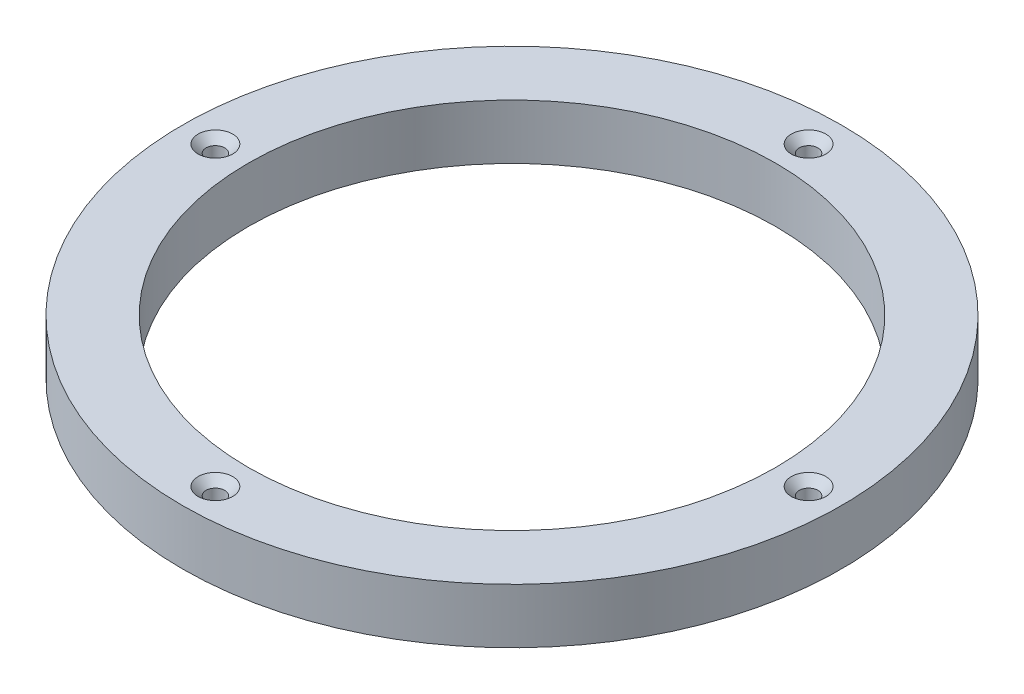
ISO-10303-21;
HEADER;
FILE_DESCRIPTION(('STEP AP214'),'2;1');
FILE_NAME('part.step','',(''),(''),'','','');
FILE_SCHEMA(('AUTOMOTIVE_DESIGN { 1 0 10303 214 1 1 1 1 }'));
ENDSEC;
DATA;
#1=APPLICATION_CONTEXT('core data for automotive mechanical design processes');
#2=APPLICATION_PROTOCOL_DEFINITION('international standard','automotive_design',2000,#1);
#3=PRODUCT_CONTEXT('',#1,'mechanical');
#4=PRODUCT('Part','Part','',(#3));
#5=PRODUCT_RELATED_PRODUCT_CATEGORY('part','',(#4));
#6=PRODUCT_DEFINITION_FORMATION('','',#4);
#7=PRODUCT_DEFINITION_CONTEXT('part definition',#1,'design');
#8=PRODUCT_DEFINITION('design','',#6,#7);
#9=PRODUCT_DEFINITION_SHAPE('','',#8);
#10=(LENGTH_UNIT() NAMED_UNIT(*) SI_UNIT(.MILLI.,.METRE.));
#11=(NAMED_UNIT(*) PLANE_ANGLE_UNIT() SI_UNIT($,.RADIAN.));
#12=(NAMED_UNIT(*) SI_UNIT($,.STERADIAN.) SOLID_ANGLE_UNIT());
#13=UNCERTAINTY_MEASURE_WITH_UNIT(LENGTH_MEASURE(1.E-05),#10,'distance_accuracy_value','');
#14=(GEOMETRIC_REPRESENTATION_CONTEXT(3) GLOBAL_UNCERTAINTY_ASSIGNED_CONTEXT((#13)) GLOBAL_UNIT_ASSIGNED_CONTEXT((#10,
#11,#12)) REPRESENTATION_CONTEXT('',''));
#15=CARTESIAN_POINT('',(0.,0.,0.));
#16=DIRECTION('',(0.,0.,1.));
#17=DIRECTION('',(1.,0.,0.));
#18=AXIS2_PLACEMENT_3D('',#15,#16,#17);
#19=CARTESIAN_POINT('',(0.,10.,0.));
#20=DIRECTION('',(0.,1.,0.));
#21=DIRECTION('',(0.,0.,1.));
#22=AXIS2_PLACEMENT_3D('',#19,#20,#21);
#23=PLANE('',#22);
#24=CARTESIAN_POINT('',(0.,10.,54.));
#25=DIRECTION('',(0.,1.,0.));
#26=DIRECTION('',(0.,0.,1.));
#27=AXIS2_PLACEMENT_3D('',#24,#25,#26);
#28=CIRCLE('',#27,3.15);
#29=CARTESIAN_POINT('',(0.,10.,57.15));
#30=VERTEX_POINT('',#29);
#31=EDGE_CURVE('E131',#30,#30,#28,.T.);
#32=ORIENTED_EDGE('',*,*,#31,.F.);
#33=EDGE_LOOP('',(#32));
#34=FACE_BOUND('',#33,.T.);
#35=CARTESIAN_POINT('',(54.,10.,0.));
#36=DIRECTION('',(0.,1.,0.));
#37=DIRECTION('',(0.,0.,1.));
#38=AXIS2_PLACEMENT_3D('',#35,#36,#37);
#39=CIRCLE('',#38,3.15);
#40=CARTESIAN_POINT('',(54.,10.,3.15));
#41=VERTEX_POINT('',#40);
#42=EDGE_CURVE('E82',#41,#41,#39,.T.);
#43=ORIENTED_EDGE('',*,*,#42,.F.);
#44=EDGE_LOOP('',(#43));
#45=FACE_BOUND('',#44,.T.);
#46=CARTESIAN_POINT('',(0.,10.,-54.));
#47=DIRECTION('',(0.,1.,0.));
#48=DIRECTION('',(0.,0.,1.));
#49=AXIS2_PLACEMENT_3D('',#46,#47,#48);
#50=CIRCLE('',#49,3.15);
#51=CARTESIAN_POINT('',(0.,10.,-50.85));
#52=VERTEX_POINT('',#51);
#53=EDGE_CURVE('E73',#52,#52,#50,.T.);
#54=ORIENTED_EDGE('',*,*,#53,.F.);
#55=EDGE_LOOP('',(#54));
#56=FACE_BOUND('',#55,.T.);
#57=CARTESIAN_POINT('',(-54.,10.,0.));
#58=DIRECTION('',(0.,1.,0.));
#59=DIRECTION('',(0.,0.,1.));
#60=AXIS2_PLACEMENT_3D('',#57,#58,#59);
#61=CIRCLE('',#60,3.15);
#62=CARTESIAN_POINT('',(-54.,10.,3.15));
#63=VERTEX_POINT('',#62);
#64=EDGE_CURVE('E68',#63,#63,#61,.T.);
#65=ORIENTED_EDGE('',*,*,#64,.F.);
#66=EDGE_LOOP('',(#65));
#67=FACE_BOUND('',#66,.T.);
#68=CARTESIAN_POINT('',(0.,10.,0.));
#69=DIRECTION('',(0.,1.,0.));
#70=DIRECTION('',(0.,0.,1.));
#71=AXIS2_PLACEMENT_3D('',#68,#69,#70);
#72=CIRCLE('',#71,60.);
#73=CARTESIAN_POINT('',(0.,10.,60.));
#74=VERTEX_POINT('',#73);
#75=EDGE_CURVE('E10',#74,#74,#72,.T.);
#76=ORIENTED_EDGE('',*,*,#75,.T.);
#77=EDGE_LOOP('',(#76));
#78=FACE_BOUND('',#77,.T.);
#79=CARTESIAN_POINT('',(0.,10.,0.));
#80=DIRECTION('',(0.,1.,0.));
#81=DIRECTION('',(0.,0.,1.));
#82=AXIS2_PLACEMENT_3D('',#79,#80,#81);
#83=CIRCLE('',#82,48.);
#84=CARTESIAN_POINT('',(0.,10.,48.));
#85=VERTEX_POINT('',#84);
#86=EDGE_CURVE('E54',#85,#85,#83,.T.);
#87=ORIENTED_EDGE('',*,*,#86,.F.);
#88=EDGE_LOOP('',(#87));
#89=FACE_BOUND('',#88,.T.);
#90=ADVANCED_FACE('F39',(#34,#45,#56,#67,#78,#89),#23,.T.);
#91=CARTESIAN_POINT('',(0.,0.,0.));
#92=DIRECTION('',(0.,1.,0.));
#93=DIRECTION('',(0.,0.,1.));
#94=AXIS2_PLACEMENT_3D('',#91,#92,#93);
#95=PLANE('',#94);
#96=CARTESIAN_POINT('',(0.,0.,54.));
#97=DIRECTION('',(0.,1.,0.));
#98=DIRECTION('',(0.,0.,1.));
#99=AXIS2_PLACEMENT_3D('',#96,#97,#98);
#100=CIRCLE('',#99,1.69999999999998);
#101=CARTESIAN_POINT('',(0.,0.,55.7));
#102=VERTEX_POINT('',#101);
#103=EDGE_CURVE('E43',#102,#102,#100,.T.);
#104=ORIENTED_EDGE('',*,*,#103,.T.);
#105=EDGE_LOOP('',(#104));
#106=FACE_BOUND('',#105,.T.);
#107=CARTESIAN_POINT('',(54.,0.,0.));
#108=DIRECTION('',(0.,1.,0.));
#109=DIRECTION('',(0.,0.,1.));
#110=AXIS2_PLACEMENT_3D('',#107,#108,#109);
#111=CIRCLE('',#110,1.69999999999998);
#112=CARTESIAN_POINT('',(54.,0.,1.69999999999998));
#113=VERTEX_POINT('',#112);
#114=EDGE_CURVE('E70',#113,#113,#111,.T.);
#115=ORIENTED_EDGE('',*,*,#114,.T.);
#116=EDGE_LOOP('',(#115));
#117=FACE_BOUND('',#116,.T.);
#118=CARTESIAN_POINT('',(0.,0.,-54.));
#119=DIRECTION('',(0.,1.,0.));
#120=DIRECTION('',(0.,0.,1.));
#121=AXIS2_PLACEMENT_3D('',#118,#119,#120);
#122=CIRCLE('',#121,1.69999999999998);
#123=CARTESIAN_POINT('',(0.,0.,-52.3));
#124=VERTEX_POINT('',#123);
#125=EDGE_CURVE('E65',#124,#124,#122,.T.);
#126=ORIENTED_EDGE('',*,*,#125,.T.);
#127=EDGE_LOOP('',(#126));
#128=FACE_BOUND('',#127,.T.);
#129=CARTESIAN_POINT('',(-54.,0.,0.));
#130=DIRECTION('',(0.,1.,0.));
#131=DIRECTION('',(0.,0.,1.));
#132=AXIS2_PLACEMENT_3D('',#129,#130,#131);
#133=CIRCLE('',#132,1.69999999999998);
#134=CARTESIAN_POINT('',(-54.,0.,1.69999999999998));
#135=VERTEX_POINT('',#134);
#136=EDGE_CURVE('E60',#135,#135,#133,.T.);
#137=ORIENTED_EDGE('',*,*,#136,.T.);
#138=EDGE_LOOP('',(#137));
#139=FACE_BOUND('',#138,.T.);
#140=CARTESIAN_POINT('',(0.,0.,0.));
#141=DIRECTION('',(0.,1.,0.));
#142=DIRECTION('',(0.,0.,1.));
#143=AXIS2_PLACEMENT_3D('',#140,#141,#142);
#144=CIRCLE('',#143,60.);
#145=CARTESIAN_POINT('',(0.,0.,60.));
#146=VERTEX_POINT('',#145);
#147=EDGE_CURVE('E48',#146,#146,#144,.T.);
#148=ORIENTED_EDGE('',*,*,#147,.F.);
#149=EDGE_LOOP('',(#148));
#150=FACE_BOUND('',#149,.T.);
#151=CARTESIAN_POINT('',(0.,0.,0.));
#152=DIRECTION('',(0.,1.,0.));
#153=DIRECTION('',(0.,0.,1.));
#154=AXIS2_PLACEMENT_3D('',#151,#152,#153);
#155=CIRCLE('',#154,48.);
#156=CARTESIAN_POINT('',(0.,0.,48.));
#157=VERTEX_POINT('',#156);
#158=EDGE_CURVE('E57',#157,#157,#155,.T.);
#159=ORIENTED_EDGE('',*,*,#158,.T.);
#160=EDGE_LOOP('',(#159));
#161=FACE_BOUND('',#160,.T.);
#162=ADVANCED_FACE('F107',(#106,#117,#128,#139,#150,#161),#95,.F.);
#163=CARTESIAN_POINT('',(0.,10.,0.));
#164=DIRECTION('',(0.,-1.,0.));
#165=DIRECTION('',(0.,0.,-1.));
#166=AXIS2_PLACEMENT_3D('',#163,#164,#165);
#167=CYLINDRICAL_SURFACE('',#166,60.);
#168=ORIENTED_EDGE('',*,*,#75,.F.);
#169=EDGE_LOOP('',(#168));
#170=FACE_BOUND('',#169,.T.);
#171=ORIENTED_EDGE('',*,*,#147,.T.);
#172=EDGE_LOOP('',(#171));
#173=FACE_BOUND('',#172,.T.);
#174=ADVANCED_FACE('F41',(#170,#173),#167,.T.);
#175=CARTESIAN_POINT('',(0.,10.,0.));
#176=DIRECTION('',(0.,-1.,0.));
#177=DIRECTION('',(0.,0.,-1.));
#178=AXIS2_PLACEMENT_3D('',#175,#176,#177);
#179=CYLINDRICAL_SURFACE('',#178,48.);
#180=ORIENTED_EDGE('',*,*,#86,.T.);
#181=EDGE_LOOP('',(#180));
#182=FACE_BOUND('',#181,.T.);
#183=ORIENTED_EDGE('',*,*,#158,.F.);
#184=EDGE_LOOP('',(#183));
#185=FACE_BOUND('',#184,.T.);
#186=ADVANCED_FACE('F109',(#182,#185),#179,.F.);
#187=CARTESIAN_POINT('',(-54.,10.,0.));
#188=DIRECTION('',(0.,1.,0.));
#189=DIRECTION('',(0.,0.,1.));
#190=AXIS2_PLACEMENT_3D('',#187,#188,#189);
#191=CYLINDRICAL_SURFACE('',#190,1.69999999999998);
#192=CARTESIAN_POINT('',(-54.,8.55,0.));
#193=DIRECTION('',(0.,1.,0.));
#194=DIRECTION('',(0.,0.,1.));
#195=AXIS2_PLACEMENT_3D('',#192,#193,#194);
#196=CIRCLE('',#195,1.69999999999999);
#197=CARTESIAN_POINT('',(-54.,8.55,1.69999999999999));
#198=VERTEX_POINT('',#197);
#199=EDGE_CURVE('E64',#198,#198,#196,.T.);
#200=ORIENTED_EDGE('',*,*,#199,.T.);
#201=EDGE_LOOP('',(#200));
#202=FACE_BOUND('',#201,.T.);
#203=ORIENTED_EDGE('',*,*,#136,.F.);
#204=EDGE_LOOP('',(#203));
#205=FACE_BOUND('',#204,.T.);
#206=ADVANCED_FACE('F111',(#202,#205),#191,.F.);
#207=CARTESIAN_POINT('',(-54.,10.,0.));
#208=DIRECTION('',(0.,1.,0.));
#209=DIRECTION('',(0.,0.,1.));
#210=AXIS2_PLACEMENT_3D('',#207,#208,#209);
#211=CONICAL_SURFACE('',#210,3.15,0.78539816339745);
#212=ORIENTED_EDGE('',*,*,#199,.F.);
#213=EDGE_LOOP('',(#212));
#214=FACE_BOUND('',#213,.T.);
#215=ORIENTED_EDGE('',*,*,#64,.T.);
#216=EDGE_LOOP('',(#215));
#217=FACE_BOUND('',#216,.T.);
#218=ADVANCED_FACE('F117',(#214,#217),#211,.F.);
#219=CARTESIAN_POINT('',(0.,10.,-54.));
#220=DIRECTION('',(0.,1.,0.));
#221=DIRECTION('',(0.,0.,1.));
#222=AXIS2_PLACEMENT_3D('',#219,#220,#221);
#223=CYLINDRICAL_SURFACE('',#222,1.69999999999998);
#224=CARTESIAN_POINT('',(0.,8.55,-54.));
#225=DIRECTION('',(0.,1.,0.));
#226=DIRECTION('',(0.,0.,1.));
#227=AXIS2_PLACEMENT_3D('',#224,#225,#226);
#228=CIRCLE('',#227,1.69999999999999);
#229=CARTESIAN_POINT('',(0.,8.55,-52.3));
#230=VERTEX_POINT('',#229);
#231=EDGE_CURVE('E69',#230,#230,#228,.T.);
#232=ORIENTED_EDGE('',*,*,#231,.T.);
#233=EDGE_LOOP('',(#232));
#234=FACE_BOUND('',#233,.T.);
#235=ORIENTED_EDGE('',*,*,#125,.F.);
#236=EDGE_LOOP('',(#235));
#237=FACE_BOUND('',#236,.T.);
#238=ADVANCED_FACE('F140',(#234,#237),#223,.F.);
#239=CARTESIAN_POINT('',(0.,10.,-54.));
#240=DIRECTION('',(0.,1.,0.));
#241=DIRECTION('',(0.,0.,1.));
#242=AXIS2_PLACEMENT_3D('',#239,#240,#241);
#243=CONICAL_SURFACE('',#242,3.15,0.78539816339745);
#244=ORIENTED_EDGE('',*,*,#231,.F.);
#245=EDGE_LOOP('',(#244));
#246=FACE_BOUND('',#245,.T.);
#247=ORIENTED_EDGE('',*,*,#53,.T.);
#248=EDGE_LOOP('',(#247));
#249=FACE_BOUND('',#248,.T.);
#250=ADVANCED_FACE('F146',(#246,#249),#243,.F.);
#251=CARTESIAN_POINT('',(54.,10.,0.));
#252=DIRECTION('',(0.,1.,0.));
#253=DIRECTION('',(0.,0.,1.));
#254=AXIS2_PLACEMENT_3D('',#251,#252,#253);
#255=CYLINDRICAL_SURFACE('',#254,1.69999999999998);
#256=CARTESIAN_POINT('',(54.,8.55,0.));
#257=DIRECTION('',(0.,1.,0.));
#258=DIRECTION('',(0.,0.,1.));
#259=AXIS2_PLACEMENT_3D('',#256,#257,#258);
#260=CIRCLE('',#259,1.69999999999999);
#261=CARTESIAN_POINT('',(54.,8.55,1.69999999999999));
#262=VERTEX_POINT('',#261);
#263=EDGE_CURVE('E74',#262,#262,#260,.T.);
#264=ORIENTED_EDGE('',*,*,#263,.T.);
#265=EDGE_LOOP('',(#264));
#266=FACE_BOUND('',#265,.T.);
#267=ORIENTED_EDGE('',*,*,#114,.F.);
#268=EDGE_LOOP('',(#267));
#269=FACE_BOUND('',#268,.T.);
#270=ADVANCED_FACE('F153',(#266,#269),#255,.F.);
#271=CARTESIAN_POINT('',(54.,10.,0.));
#272=DIRECTION('',(0.,1.,0.));
#273=DIRECTION('',(0.,0.,1.));
#274=AXIS2_PLACEMENT_3D('',#271,#272,#273);
#275=CONICAL_SURFACE('',#274,3.15,0.78539816339745);
#276=ORIENTED_EDGE('',*,*,#263,.F.);
#277=EDGE_LOOP('',(#276));
#278=FACE_BOUND('',#277,.T.);
#279=ORIENTED_EDGE('',*,*,#42,.T.);
#280=EDGE_LOOP('',(#279));
#281=FACE_BOUND('',#280,.T.);
#282=ADVANCED_FACE('F157',(#278,#281),#275,.F.);
#283=CARTESIAN_POINT('',(0.,10.,54.));
#284=DIRECTION('',(0.,1.,0.));
#285=DIRECTION('',(0.,0.,1.));
#286=AXIS2_PLACEMENT_3D('',#283,#284,#285);
#287=CYLINDRICAL_SURFACE('',#286,1.69999999999998);
#288=CARTESIAN_POINT('',(0.,8.55,54.));
#289=DIRECTION('',(0.,1.,0.));
#290=DIRECTION('',(0.,0.,1.));
#291=AXIS2_PLACEMENT_3D('',#288,#289,#290);
#292=CIRCLE('',#291,1.69999999999999);
#293=CARTESIAN_POINT('',(0.,8.55,55.7));
#294=VERTEX_POINT('',#293);
#295=EDGE_CURVE('E173',#294,#294,#292,.T.);
#296=ORIENTED_EDGE('',*,*,#295,.T.);
#297=EDGE_LOOP('',(#296));
#298=FACE_BOUND('',#297,.T.);
#299=ORIENTED_EDGE('',*,*,#103,.F.);
#300=EDGE_LOOP('',(#299));
#301=FACE_BOUND('',#300,.T.);
#302=ADVANCED_FACE('F160',(#298,#301),#287,.F.);
#303=CARTESIAN_POINT('',(0.,10.,54.));
#304=DIRECTION('',(0.,1.,0.));
#305=DIRECTION('',(0.,0.,1.));
#306=AXIS2_PLACEMENT_3D('',#303,#304,#305);
#307=CONICAL_SURFACE('',#306,3.15,0.78539816339745);
#308=ORIENTED_EDGE('',*,*,#295,.F.);
#309=EDGE_LOOP('',(#308));
#310=FACE_BOUND('',#309,.T.);
#311=ORIENTED_EDGE('',*,*,#31,.T.);
#312=EDGE_LOOP('',(#311));
#313=FACE_BOUND('',#312,.T.);
#314=ADVANCED_FACE('F164',(#310,#313),#307,.F.);
#315=CLOSED_SHELL('',(#90,#162,#174,#186,#206,#218,#238,#250,#270,#282,#302,#314));
#316=MANIFOLD_SOLID_BREP('B2',#315);
#317=ADVANCED_BREP_SHAPE_REPRESENTATION('',(#18,#316),#14);
#318=SHAPE_DEFINITION_REPRESENTATION(#9,#317);
ENDSEC;
END-ISO-10303-21;
